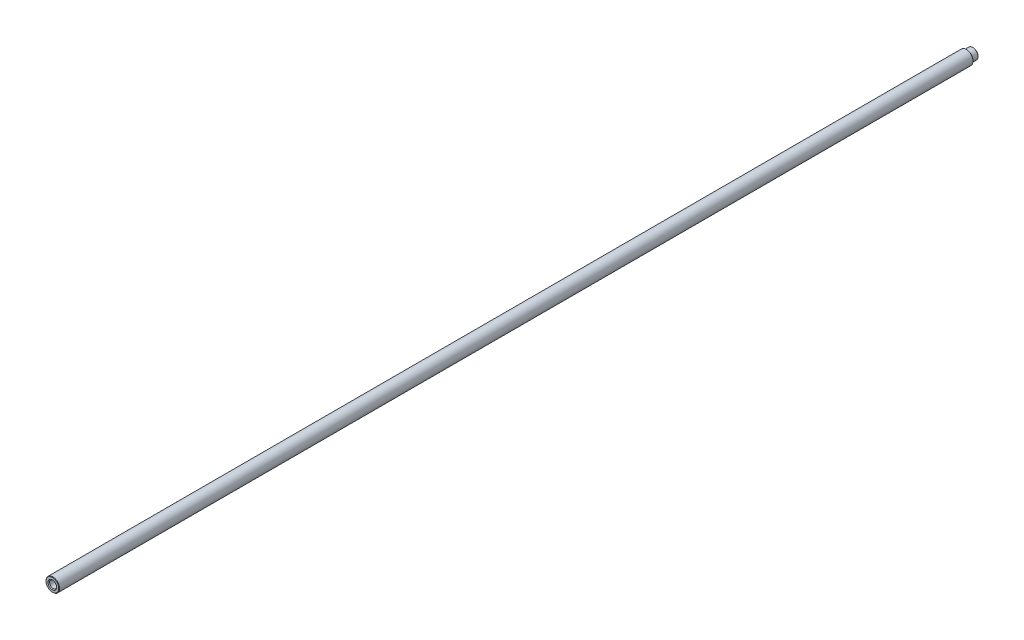
ISO-10303-21;
HEADER;
FILE_DESCRIPTION(('STEP AP214'),'2;1');
FILE_NAME('part.step','',(''),(''),'','','');
FILE_SCHEMA(('AUTOMOTIVE_DESIGN { 1 0 10303 214 1 1 1 1 }'));
ENDSEC;
DATA;
#1=APPLICATION_CONTEXT('core data for automotive mechanical design processes');
#2=APPLICATION_PROTOCOL_DEFINITION('international standard','automotive_design',2000,#1);
#3=PRODUCT_CONTEXT('',#1,'mechanical');
#4=PRODUCT('Part','Part','',(#3));
#5=PRODUCT_RELATED_PRODUCT_CATEGORY('part','',(#4));
#6=PRODUCT_DEFINITION_FORMATION('','',#4);
#7=PRODUCT_DEFINITION_CONTEXT('part definition',#1,'design');
#8=PRODUCT_DEFINITION('design','',#6,#7);
#9=PRODUCT_DEFINITION_SHAPE('','',#8);
#10=(LENGTH_UNIT() NAMED_UNIT(*) SI_UNIT(.MILLI.,.METRE.));
#11=(NAMED_UNIT(*) PLANE_ANGLE_UNIT() SI_UNIT($,.RADIAN.));
#12=(NAMED_UNIT(*) SI_UNIT($,.STERADIAN.) SOLID_ANGLE_UNIT());
#13=UNCERTAINTY_MEASURE_WITH_UNIT(LENGTH_MEASURE(1.E-05),#10,'distance_accuracy_value','');
#14=(GEOMETRIC_REPRESENTATION_CONTEXT(3) GLOBAL_UNCERTAINTY_ASSIGNED_CONTEXT((#13)) GLOBAL_UNIT_ASSIGNED_CONTEXT((#10,
#11,#12)) REPRESENTATION_CONTEXT('',''));
#15=CARTESIAN_POINT('',(0.,0.,0.));
#16=DIRECTION('',(0.,0.,1.));
#17=DIRECTION('',(1.,0.,0.));
#18=AXIS2_PLACEMENT_3D('',#15,#16,#17);
#19=CARTESIAN_POINT('',(0.,0.,215.));
#20=DIRECTION('',(0.,0.,-1.));
#21=DIRECTION('',(-1.,0.,0.));
#22=AXIS2_PLACEMENT_3D('',#19,#20,#21);
#23=CYLINDRICAL_SURFACE('',#22,3.175);
#24=CARTESIAN_POINT('',(0.,0.,-211.8));
#25=DIRECTION('',(0.,0.,-1.));
#26=DIRECTION('',(-1.,0.,0.));
#27=AXIS2_PLACEMENT_3D('',#24,#25,#26);
#28=CIRCLE('',#27,3.175);
#29=CARTESIAN_POINT('',(-3.175,0.,-211.8));
#30=VERTEX_POINT('',#29);
#31=EDGE_CURVE('E86',#30,#30,#28,.F.);
#32=ORIENTED_EDGE('',*,*,#31,.T.);
#33=EDGE_LOOP('',(#32));
#34=FACE_BOUND('',#33,.T.);
#35=CARTESIAN_POINT('',(0.,0.,214.8));
#36=DIRECTION('',(0.,0.,1.));
#37=DIRECTION('',(1.,0.,0.));
#38=AXIS2_PLACEMENT_3D('',#35,#36,#37);
#39=CIRCLE('',#38,3.175);
#40=CARTESIAN_POINT('',(3.175,0.,214.8));
#41=VERTEX_POINT('',#40);
#42=EDGE_CURVE('E83',#41,#41,#39,.F.);
#43=ORIENTED_EDGE('',*,*,#42,.T.);
#44=EDGE_LOOP('',(#43));
#45=FACE_BOUND('',#44,.T.);
#46=ADVANCED_FACE('F39',(#34,#45),#23,.T.);
#47=CARTESIAN_POINT('',(0.,0.,215.));
#48=DIRECTION('',(0.,0.,1.));
#49=DIRECTION('',(1.,0.,0.));
#50=AXIS2_PLACEMENT_3D('',#47,#48,#49);
#51=PLANE('',#50);
#52=CARTESIAN_POINT('',(0.,0.,215.));
#53=DIRECTION('',(0.,0.,1.));
#54=DIRECTION('',(1.,0.,0.));
#55=AXIS2_PLACEMENT_3D('',#52,#53,#54);
#56=CIRCLE('',#55,2.97499999999995);
#57=CARTESIAN_POINT('',(2.97499999999995,0.,215.));
#58=VERTEX_POINT('',#57);
#59=EDGE_CURVE('E11',#58,#58,#56,.T.);
#60=ORIENTED_EDGE('',*,*,#59,.T.);
#61=EDGE_LOOP('',(#60));
#62=FACE_BOUND('',#61,.T.);
#63=CARTESIAN_POINT('',(0.,0.,215.));
#64=DIRECTION('',(0.,0.,1.));
#65=DIRECTION('',(1.,0.,0.));
#66=AXIS2_PLACEMENT_3D('',#63,#64,#65);
#67=CIRCLE('',#66,2.);
#68=CARTESIAN_POINT('',(2.,0.,215.));
#69=VERTEX_POINT('',#68);
#70=EDGE_CURVE('E71',#69,#69,#67,.T.);
#71=ORIENTED_EDGE('',*,*,#70,.F.);
#72=EDGE_LOOP('',(#71));
#73=FACE_BOUND('',#72,.T.);
#74=ADVANCED_FACE('F58',(#62,#73),#51,.T.);
#75=CARTESIAN_POINT('',(0.,0.,201.5));
#76=DIRECTION('',(0.,0.,1.));
#77=DIRECTION('',(1.,0.,0.));
#78=AXIS2_PLACEMENT_3D('',#75,#76,#77);
#79=CONICAL_SURFACE('',#78,1.65,1.02974425867666);
#80=CARTESIAN_POINT('',(0.,0.,200.508579978605));
#81=VERTEX_POINT('',#80);
#82=VERTEX_LOOP('',#81);
#83=FACE_BOUND('',#82,.T.);
#84=CARTESIAN_POINT('',(0.,0.,201.5));
#85=DIRECTION('',(0.,0.,1.));
#86=DIRECTION('',(1.,0.,0.));
#87=AXIS2_PLACEMENT_3D('',#84,#85,#86);
#88=CIRCLE('',#87,1.65);
#89=CARTESIAN_POINT('',(1.65,0.,201.5));
#90=VERTEX_POINT('',#89);
#91=EDGE_CURVE('E62',#90,#90,#88,.T.);
#92=ORIENTED_EDGE('',*,*,#91,.T.);
#93=EDGE_LOOP('',(#92));
#94=FACE_BOUND('',#93,.T.);
#95=ADVANCED_FACE('F54',(#83,#94),#79,.F.);
#96=CARTESIAN_POINT('',(0.,0.,215.));
#97=DIRECTION('',(0.,0.,1.));
#98=DIRECTION('',(1.,0.,0.));
#99=AXIS2_PLACEMENT_3D('',#96,#97,#98);
#100=CYLINDRICAL_SURFACE('',#99,1.65);
#101=ORIENTED_EDGE('',*,*,#91,.F.);
#102=EDGE_LOOP('',(#101));
#103=FACE_BOUND('',#102,.T.);
#104=CARTESIAN_POINT('',(0.,0.,214.65));
#105=DIRECTION('',(0.,0.,1.));
#106=DIRECTION('',(1.,0.,0.));
#107=AXIS2_PLACEMENT_3D('',#104,#105,#106);
#108=CIRCLE('',#107,1.65);
#109=CARTESIAN_POINT('',(1.65,0.,214.65));
#110=VERTEX_POINT('',#109);
#111=EDGE_CURVE('E65',#110,#110,#108,.T.);
#112=ORIENTED_EDGE('',*,*,#111,.T.);
#113=EDGE_LOOP('',(#112));
#114=FACE_BOUND('',#113,.T.);
#115=ADVANCED_FACE('F57',(#103,#114),#100,.F.);
#116=CARTESIAN_POINT('',(0.,0.,215.));
#117=DIRECTION('',(0.,0.,1.));
#118=DIRECTION('',(1.,0.,0.));
#119=AXIS2_PLACEMENT_3D('',#116,#117,#118);
#120=CONICAL_SURFACE('',#119,2.,0.785398163397467);
#121=ORIENTED_EDGE('',*,*,#111,.F.);
#122=EDGE_LOOP('',(#121));
#123=FACE_BOUND('',#122,.T.);
#124=ORIENTED_EDGE('',*,*,#70,.T.);
#125=EDGE_LOOP('',(#124));
#126=FACE_BOUND('',#125,.T.);
#127=ADVANCED_FACE('F158',(#123,#126),#120,.F.);
#128=CARTESIAN_POINT('',(0.,0.,-232.2463));
#129=DIRECTION('',(0.,0.,-1.));
#130=DIRECTION('',(-1.,0.,0.));
#131=AXIS2_PLACEMENT_3D('',#128,#129,#130);
#132=CYLINDRICAL_SURFACE('',#131,2.5);
#133=CARTESIAN_POINT('',(0.,0.,-214.8));
#134=DIRECTION('',(0.,0.,1.));
#135=DIRECTION('',(1.,0.,0.));
#136=AXIS2_PLACEMENT_3D('',#133,#134,#135);
#137=CIRCLE('',#136,2.5);
#138=CARTESIAN_POINT('',(2.49999999999999,0.,-214.8));
#139=VERTEX_POINT('',#138);
#140=EDGE_CURVE('E48',#139,#139,#137,.T.);
#141=ORIENTED_EDGE('',*,*,#140,.T.);
#142=EDGE_LOOP('',(#141));
#143=FACE_BOUND('',#142,.T.);
#144=CARTESIAN_POINT('',(0.,0.,-212.));
#145=DIRECTION('',(0.,0.,-1.));
#146=DIRECTION('',(-1.,0.,0.));
#147=AXIS2_PLACEMENT_3D('',#144,#145,#146);
#148=CIRCLE('',#147,2.5);
#149=CARTESIAN_POINT('',(-2.5,0.,-212.));
#150=VERTEX_POINT('',#149);
#151=EDGE_CURVE('E153',#150,#150,#148,.T.);
#152=ORIENTED_EDGE('',*,*,#151,.T.);
#153=EDGE_LOOP('',(#152));
#154=FACE_BOUND('',#153,.T.);
#155=ADVANCED_FACE('F94',(#143,#154),#132,.T.);
#156=CARTESIAN_POINT('',(2.5,0.,-212.));
#157=DIRECTION('',(0.,0.,-1.));
#158=DIRECTION('',(-1.,0.,0.));
#159=AXIS2_PLACEMENT_3D('',#156,#157,#158);
#160=PLANE('',#159);
#161=CARTESIAN_POINT('',(0.,0.,-212.));
#162=DIRECTION('',(0.,0.,-1.));
#163=DIRECTION('',(-1.,0.,0.));
#164=AXIS2_PLACEMENT_3D('',#161,#162,#163);
#165=CIRCLE('',#164,2.97499999999995);
#166=CARTESIAN_POINT('',(-2.97499999999995,0.,-212.));
#167=VERTEX_POINT('',#166);
#168=EDGE_CURVE('E80',#167,#167,#165,.T.);
#169=ORIENTED_EDGE('',*,*,#168,.T.);
#170=EDGE_LOOP('',(#169));
#171=FACE_BOUND('',#170,.T.);
#172=ORIENTED_EDGE('',*,*,#151,.F.);
#173=EDGE_LOOP('',(#172));
#174=FACE_BOUND('',#173,.T.);
#175=ADVANCED_FACE('F147',(#171,#174),#160,.T.);
#176=CARTESIAN_POINT('',(0.,0.,-201.5));
#177=DIRECTION('',(0.,0.,-1.));
#178=DIRECTION('',(-1.,0.,0.));
#179=AXIS2_PLACEMENT_3D('',#176,#177,#178);
#180=CONICAL_SURFACE('',#179,1.65,1.02974425867666);
#181=CARTESIAN_POINT('',(0.,0.,-200.508579978605));
#182=VERTEX_POINT('',#181);
#183=VERTEX_LOOP('',#182);
#184=FACE_BOUND('',#183,.T.);
#185=CARTESIAN_POINT('',(0.,0.,-201.5));
#186=DIRECTION('',(0.,0.,-1.));
#187=DIRECTION('',(-1.,0.,0.));
#188=AXIS2_PLACEMENT_3D('',#185,#186,#187);
#189=CIRCLE('',#188,1.65);
#190=CARTESIAN_POINT('',(-1.65,0.,-201.5));
#191=VERTEX_POINT('',#190);
#192=EDGE_CURVE('E77',#191,#191,#189,.T.);
#193=ORIENTED_EDGE('',*,*,#192,.T.);
#194=EDGE_LOOP('',(#193));
#195=FACE_BOUND('',#194,.T.);
#196=ADVANCED_FACE('F117',(#184,#195),#180,.F.);
#197=CARTESIAN_POINT('',(0.,0.,-215.));
#198=DIRECTION('',(0.,0.,-1.));
#199=DIRECTION('',(-1.,0.,0.));
#200=AXIS2_PLACEMENT_3D('',#197,#198,#199);
#201=CYLINDRICAL_SURFACE('',#200,1.65);
#202=ORIENTED_EDGE('',*,*,#192,.F.);
#203=EDGE_LOOP('',(#202));
#204=FACE_BOUND('',#203,.T.);
#205=CARTESIAN_POINT('',(0.,0.,-214.65));
#206=DIRECTION('',(0.,0.,-1.));
#207=DIRECTION('',(-1.,0.,0.));
#208=AXIS2_PLACEMENT_3D('',#205,#206,#207);
#209=CIRCLE('',#208,1.65);
#210=CARTESIAN_POINT('',(-1.65,0.,-214.65));
#211=VERTEX_POINT('',#210);
#212=EDGE_CURVE('E68',#211,#211,#209,.T.);
#213=ORIENTED_EDGE('',*,*,#212,.T.);
#214=EDGE_LOOP('',(#213));
#215=FACE_BOUND('',#214,.T.);
#216=ADVANCED_FACE('F111',(#204,#215),#201,.F.);
#217=CARTESIAN_POINT('',(0.,0.,-215.));
#218=DIRECTION('',(0.,0.,-1.));
#219=DIRECTION('',(-1.,0.,0.));
#220=AXIS2_PLACEMENT_3D('',#217,#218,#219);
#221=CONICAL_SURFACE('',#220,2.,0.785398163397467);
#222=ORIENTED_EDGE('',*,*,#212,.F.);
#223=EDGE_LOOP('',(#222));
#224=FACE_BOUND('',#223,.T.);
#225=CARTESIAN_POINT('',(0.,0.,-215.));
#226=DIRECTION('',(0.,0.,-1.));
#227=DIRECTION('',(-1.,0.,0.));
#228=AXIS2_PLACEMENT_3D('',#225,#226,#227);
#229=CIRCLE('',#228,2.);
#230=CARTESIAN_POINT('',(-2.,0.,-215.));
#231=VERTEX_POINT('',#230);
#232=EDGE_CURVE('E64',#231,#231,#229,.T.);
#233=ORIENTED_EDGE('',*,*,#232,.T.);
#234=EDGE_LOOP('',(#233));
#235=FACE_BOUND('',#234,.T.);
#236=ADVANCED_FACE('F106',(#224,#235),#221,.F.);
#237=CARTESIAN_POINT('',(0.,0.,-215.));
#238=DIRECTION('',(0.,0.,1.));
#239=DIRECTION('',(1.,0.,0.));
#240=AXIS2_PLACEMENT_3D('',#237,#238,#239);
#241=PLANE('',#240);
#242=CARTESIAN_POINT('',(0.,0.,-215.));
#243=DIRECTION('',(0.,0.,1.));
#244=DIRECTION('',(1.,0.,0.));
#245=AXIS2_PLACEMENT_3D('',#242,#243,#244);
#246=CIRCLE('',#245,2.30000000000002);
#247=CARTESIAN_POINT('',(2.30000000000001,0.,-215.));
#248=VERTEX_POINT('',#247);
#249=EDGE_CURVE('E89',#248,#248,#246,.F.);
#250=ORIENTED_EDGE('',*,*,#249,.T.);
#251=EDGE_LOOP('',(#250));
#252=FACE_BOUND('',#251,.T.);
#253=ORIENTED_EDGE('',*,*,#232,.F.);
#254=EDGE_LOOP('',(#253));
#255=FACE_BOUND('',#254,.T.);
#256=ADVANCED_FACE('F103',(#252,#255),#241,.F.);
#257=CARTESIAN_POINT('',(0.,0.,-212.));
#258=DIRECTION('',(0.,0.,1.));
#259=DIRECTION('',(1.,0.,0.));
#260=AXIS2_PLACEMENT_3D('',#257,#258,#259);
#261=CONICAL_SURFACE('',#260,2.97499999999995,0.785398163397489);
#262=ORIENTED_EDGE('',*,*,#31,.F.);
#263=EDGE_LOOP('',(#262));
#264=FACE_BOUND('',#263,.T.);
#265=ORIENTED_EDGE('',*,*,#168,.F.);
#266=EDGE_LOOP('',(#265));
#267=FACE_BOUND('',#266,.T.);
#268=ADVANCED_FACE('F100',(#264,#267),#261,.T.);
#269=CARTESIAN_POINT('',(0.,0.,-215.));
#270=DIRECTION('',(0.,0.,1.));
#271=DIRECTION('',(1.,0.,0.));
#272=AXIS2_PLACEMENT_3D('',#269,#270,#271);
#273=CONICAL_SURFACE('',#272,2.30000000000002,0.785398163397443);
#274=CARTESIAN_POINT('',(2.49999999999999,0.,-214.8));
#275=CARTESIAN_POINT('',(2.49791666666666,0.,-214.802083333333));
#276=CARTESIAN_POINT('',(2.49583333333333,0.,-214.804166666667));
#277=CARTESIAN_POINT('',(2.49166666666665,0.,-214.808333333333));
#278=CARTESIAN_POINT('',(2.48958333333332,0.,-214.810416666667));
#279=CARTESIAN_POINT('',(2.48541666666665,0.,-214.814583333333));
#280=CARTESIAN_POINT('',(2.48333333333332,0.,-214.816666666667));
#281=CARTESIAN_POINT('',(2.47916666666666,0.,-214.820833333333));
#282=CARTESIAN_POINT('',(2.47708333333332,0.,-214.822916666667));
#283=CARTESIAN_POINT('',(2.47291666666665,0.,-214.827083333333));
#284=CARTESIAN_POINT('',(2.47083333333333,0.,-214.829166666667));
#285=CARTESIAN_POINT('',(2.46666666666666,0.,-214.833333333333));
#286=CARTESIAN_POINT('',(2.46458333333332,0.,-214.835416666667));
#287=CARTESIAN_POINT('',(2.46041666666666,0.,-214.839583333333));
#288=CARTESIAN_POINT('',(2.45833333333333,0.,-214.841666666667));
#289=CARTESIAN_POINT('',(2.45416666666666,0.,-214.845833333333));
#290=CARTESIAN_POINT('',(2.45208333333332,0.,-214.847916666667));
#291=CARTESIAN_POINT('',(2.44791666666666,0.,-214.852083333333));
#292=CARTESIAN_POINT('',(2.44583333333333,0.,-214.854166666667));
#293=CARTESIAN_POINT('',(2.44166666666666,0.,-214.858333333333));
#294=CARTESIAN_POINT('',(2.43958333333333,0.,-214.860416666667));
#295=CARTESIAN_POINT('',(2.43541666666666,0.,-214.864583333333));
#296=CARTESIAN_POINT('',(2.43333333333333,0.,-214.866666666667));
#297=CARTESIAN_POINT('',(2.42916666666666,0.,-214.870833333333));
#298=CARTESIAN_POINT('',(2.42708333333333,0.,-214.872916666667));
#299=CARTESIAN_POINT('',(2.42291666666666,0.,-214.877083333333));
#300=CARTESIAN_POINT('',(2.42083333333333,0.,-214.879166666667));
#301=CARTESIAN_POINT('',(2.41666666666666,0.,-214.883333333333));
#302=CARTESIAN_POINT('',(2.41458333333333,0.,-214.885416666667));
#303=CARTESIAN_POINT('',(2.41041666666666,0.,-214.889583333333));
#304=CARTESIAN_POINT('',(2.40833333333333,0.,-214.891666666667));
#305=CARTESIAN_POINT('',(2.40416666666667,0.,-214.895833333333));
#306=CARTESIAN_POINT('',(2.40208333333333,0.,-214.897916666667));
#307=CARTESIAN_POINT('',(2.39791666666666,0.,-214.902083333333));
#308=CARTESIAN_POINT('',(2.39583333333333,0.,-214.904166666667));
#309=CARTESIAN_POINT('',(2.39166666666667,0.,-214.908333333333));
#310=CARTESIAN_POINT('',(2.38958333333333,0.,-214.910416666667));
#311=CARTESIAN_POINT('',(2.38541666666666,0.,-214.914583333333));
#312=CARTESIAN_POINT('',(2.38333333333334,0.,-214.916666666667));
#313=CARTESIAN_POINT('',(2.37916666666667,0.,-214.920833333333));
#314=CARTESIAN_POINT('',(2.37708333333333,0.,-214.922916666667));
#315=CARTESIAN_POINT('',(2.37291666666667,0.,-214.927083333333));
#316=CARTESIAN_POINT('',(2.37083333333334,0.,-214.929166666667));
#317=CARTESIAN_POINT('',(2.36666666666667,0.,-214.933333333333));
#318=CARTESIAN_POINT('',(2.36458333333333,0.,-214.935416666667));
#319=CARTESIAN_POINT('',(2.36041666666667,0.,-214.939583333333));
#320=CARTESIAN_POINT('',(2.35833333333334,0.,-214.941666666667));
#321=CARTESIAN_POINT('',(2.35416666666667,0.,-214.945833333333));
#322=CARTESIAN_POINT('',(2.35208333333334,0.,-214.947916666667));
#323=CARTESIAN_POINT('',(2.34791666666667,0.,-214.952083333333));
#324=CARTESIAN_POINT('',(2.34583333333334,0.,-214.954166666667));
#325=CARTESIAN_POINT('',(2.34166666666667,0.,-214.958333333333));
#326=CARTESIAN_POINT('',(2.33958333333334,0.,-214.960416666667));
#327=CARTESIAN_POINT('',(2.33541666666667,0.,-214.964583333333));
#328=CARTESIAN_POINT('',(2.33333333333334,0.,-214.966666666667));
#329=CARTESIAN_POINT('',(2.32916666666667,0.,-214.970833333333));
#330=CARTESIAN_POINT('',(2.32708333333334,0.,-214.972916666667));
#331=CARTESIAN_POINT('',(2.32291666666668,0.,-214.977083333333));
#332=CARTESIAN_POINT('',(2.32083333333334,0.,-214.979166666667));
#333=CARTESIAN_POINT('',(2.31666666666667,0.,-214.983333333333));
#334=CARTESIAN_POINT('',(2.31458333333334,0.,-214.985416666667));
#335=CARTESIAN_POINT('',(2.31041666666668,0.,-214.989583333333));
#336=CARTESIAN_POINT('',(2.30833333333334,0.,-214.991666666667));
#337=CARTESIAN_POINT('',(2.30416666666667,0.,-214.995833333333));
#338=CARTESIAN_POINT('',(2.30208333333334,0.,-214.997916666667));
#339=CARTESIAN_POINT('',(2.30000000000001,0.,-215.));
#340=B_SPLINE_CURVE_WITH_KNOTS('',3,(#274,#275,#276,#277,#278,#279,#280,#281,#282,#283,#284,
#285,#286,#287,#288,#289,#290,#291,#292,#293,#294,#295,#296,#297,#298,#299,#300,#301,#302,#303,
#304,#305,#306,#307,#308,#309,#310,#311,#312,#313,#314,#315,#316,#317,#318,#319,#320,#321,#322,
#323,#324,#325,#326,#327,#328,#329,#330,#331,#332,#333,#334,#335,#336,#337,#338,#339),
.UNSPECIFIED.,.F.,.F.,(4,2,2,2,2,2,2,2,2,2,2,2,2,2,2,2,2,2,2,2,2,2,2,2,2,2,2,2,2,2,2,2,4),(0.,
0.00883883476484068,0.0176776695296617,0.0265165042945021,0.0353553390593232,0.0441941738241639,
0.0530330085889849,0.0618718433538256,0.0707106781186466,0.0795495128834873,0.0883883476483081,
0.0972271824131488,0.106066017177989,0.11490485194281,0.123743686707632,0.132582521472472,
0.141421356237293,0.150260191002134,0.159099025766955,0.167937860531795,0.176776695296617,
0.185615530061457,0.194454364826278,0.203293199591119,0.212132034355959,0.22097086912078,
0.229809703885621,0.238648538650442,0.247487373415283,0.256326208180104,0.265165042944944,
0.274003877709765,0.282842712474586),.UNSPECIFIED.);
#341=EDGE_CURVE('BSEAM97',#139,#248,#340,.T.);
#342=ORIENTED_EDGE('',*,*,#140,.F.);
#343=ORIENTED_EDGE('',*,*,#249,.F.);
#344=ORIENTED_EDGE('',*,*,#341,.T.);
#345=ORIENTED_EDGE('',*,*,#341,.F.);
#346=EDGE_LOOP('',(#342,#344,#343,#345));
#347=FACE_BOUND('',#346,.T.);
#348=ADVANCED_FACE('F97',(#347),#273,.T.);
#349=CARTESIAN_POINT('',(0.,0.,215.));
#350=DIRECTION('',(0.,0.,-1.));
#351=DIRECTION('',(-1.,0.,0.));
#352=AXIS2_PLACEMENT_3D('',#349,#350,#351);
#353=CONICAL_SURFACE('',#352,2.97499999999995,0.78539816339742);
#354=ORIENTED_EDGE('',*,*,#42,.F.);
#355=EDGE_LOOP('',(#354));
#356=FACE_BOUND('',#355,.T.);
#357=ORIENTED_EDGE('',*,*,#59,.F.);
#358=EDGE_LOOP('',(#357));
#359=FACE_BOUND('',#358,.T.);
#360=ADVANCED_FACE('F42',(#356,#359),#353,.T.);
#361=CLOSED_SHELL('',(#46,#74,#95,#115,#127,#155,#175,#196,#216,#236,#256,#268,#348,#360));
#362=MANIFOLD_SOLID_BREP('B2',#361);
#363=ADVANCED_BREP_SHAPE_REPRESENTATION('',(#18,#362),#14);
#364=SHAPE_DEFINITION_REPRESENTATION(#9,#363);
ENDSEC;
END-ISO-10303-21;
